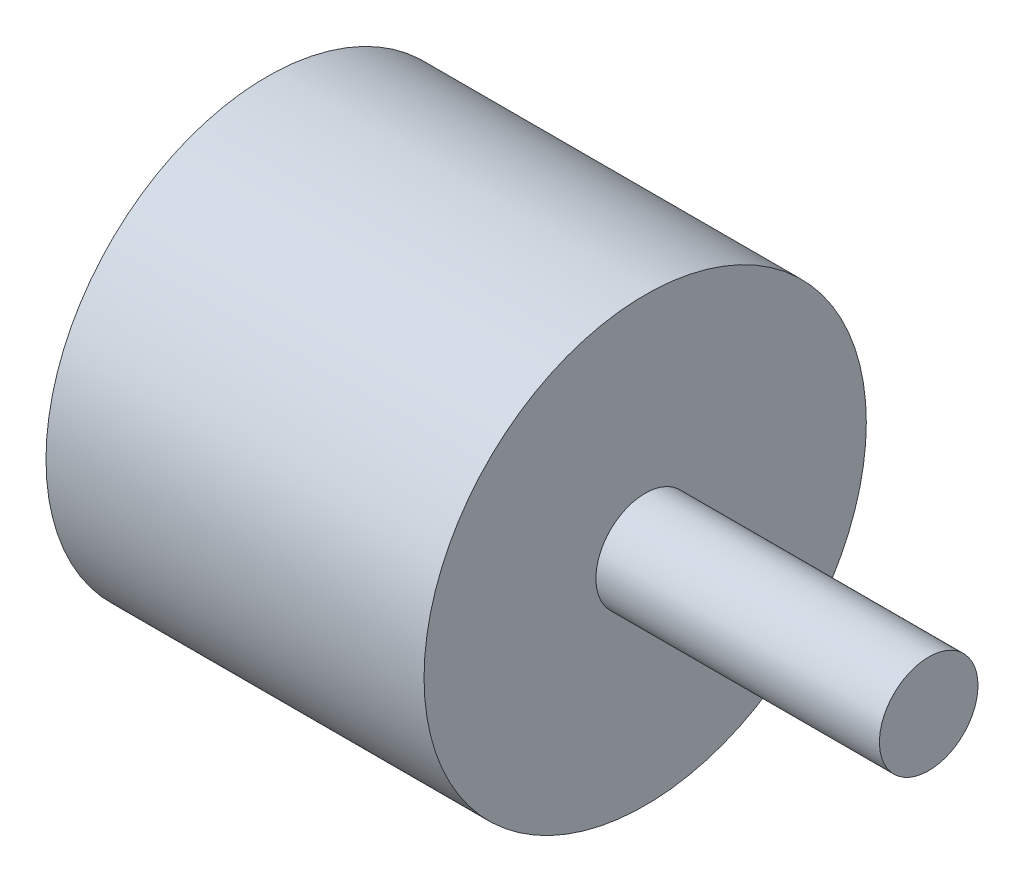
ISO-10303-21;
HEADER;
FILE_DESCRIPTION(('STEP AP214'),'2;1');
FILE_NAME('part.step','',(''),(''),'','','');
FILE_SCHEMA(('AUTOMOTIVE_DESIGN { 1 0 10303 214 1 1 1 1 }'));
ENDSEC;
DATA;
#1=APPLICATION_CONTEXT('core data for automotive mechanical design processes');
#2=APPLICATION_PROTOCOL_DEFINITION('international standard','automotive_design',2000,#1);
#3=PRODUCT_CONTEXT('',#1,'mechanical');
#4=PRODUCT('Part','Part','',(#3));
#5=PRODUCT_RELATED_PRODUCT_CATEGORY('part','',(#4));
#6=PRODUCT_DEFINITION_FORMATION('','',#4);
#7=PRODUCT_DEFINITION_CONTEXT('part definition',#1,'design');
#8=PRODUCT_DEFINITION('design','',#6,#7);
#9=PRODUCT_DEFINITION_SHAPE('','',#8);
#10=(LENGTH_UNIT() NAMED_UNIT(*) SI_UNIT(.MILLI.,.METRE.));
#11=(NAMED_UNIT(*) PLANE_ANGLE_UNIT() SI_UNIT($,.RADIAN.));
#12=(NAMED_UNIT(*) SI_UNIT($,.STERADIAN.) SOLID_ANGLE_UNIT());
#13=UNCERTAINTY_MEASURE_WITH_UNIT(LENGTH_MEASURE(1.E-05),#10,'distance_accuracy_value','');
#14=(GEOMETRIC_REPRESENTATION_CONTEXT(3) GLOBAL_UNCERTAINTY_ASSIGNED_CONTEXT((#13)) GLOBAL_UNIT_ASSIGNED_CONTEXT((#10,
#11,#12)) REPRESENTATION_CONTEXT('',''));
#15=CARTESIAN_POINT('',(0.,0.,0.));
#16=DIRECTION('',(0.,0.,1.));
#17=DIRECTION('',(1.,0.,0.));
#18=AXIS2_PLACEMENT_3D('',#15,#16,#17);
#19=CARTESIAN_POINT('',(40.,0.,0.));
#20=DIRECTION('',(-1.,0.,0.));
#21=DIRECTION('',(0.,0.,1.));
#22=AXIS2_PLACEMENT_3D('',#19,#20,#21);
#23=CYLINDRICAL_SURFACE('',#22,23.3971439157562);
#24=CARTESIAN_POINT('',(40.,0.,0.));
#25=DIRECTION('',(1.,0.,0.));
#26=DIRECTION('',(0.,0.,-1.));
#27=AXIS2_PLACEMENT_3D('',#24,#25,#26);
#28=CIRCLE('',#27,23.3971439157562);
#29=CARTESIAN_POINT('',(40.,0.,-23.3971439157562));
#30=VERTEX_POINT('',#29);
#31=EDGE_CURVE('E38',#30,#30,#28,.T.);
#32=ORIENTED_EDGE('',*,*,#31,.F.);
#33=EDGE_LOOP('',(#32));
#34=FACE_BOUND('',#33,.T.);
#35=CARTESIAN_POINT('',(0.,0.,0.));
#36=DIRECTION('',(1.,0.,0.));
#37=DIRECTION('',(0.,0.,-1.));
#38=AXIS2_PLACEMENT_3D('',#35,#36,#37);
#39=CIRCLE('',#38,23.3971439157562);
#40=CARTESIAN_POINT('',(0.,0.,-23.3971439157562));
#41=VERTEX_POINT('',#40);
#42=EDGE_CURVE('E34',#41,#41,#39,.T.);
#43=ORIENTED_EDGE('',*,*,#42,.T.);
#44=EDGE_LOOP('',(#43));
#45=FACE_BOUND('',#44,.T.);
#46=ADVANCED_FACE('F31',(#34,#45),#23,.T.);
#47=CARTESIAN_POINT('',(40.,0.,0.));
#48=DIRECTION('',(1.,0.,0.));
#49=DIRECTION('',(0.,0.,-1.));
#50=AXIS2_PLACEMENT_3D('',#47,#48,#49);
#51=PLANE('',#50);
#52=CARTESIAN_POINT('',(40.,0.,0.));
#53=DIRECTION('',(1.,0.,0.));
#54=DIRECTION('',(0.,0.,-1.));
#55=AXIS2_PLACEMENT_3D('',#52,#53,#54);
#56=CIRCLE('',#55,5.21429466032859);
#57=CARTESIAN_POINT('',(40.,0.,-5.21429466032859));
#58=VERTEX_POINT('',#57);
#59=EDGE_CURVE('E10',#58,#58,#56,.T.);
#60=ORIENTED_EDGE('',*,*,#59,.F.);
#61=EDGE_LOOP('',(#60));
#62=FACE_BOUND('',#61,.T.);
#63=ORIENTED_EDGE('',*,*,#31,.T.);
#64=EDGE_LOOP('',(#63));
#65=FACE_BOUND('',#64,.T.);
#66=ADVANCED_FACE('F55',(#62,#65),#51,.T.);
#67=CARTESIAN_POINT('',(0.,0.,0.));
#68=DIRECTION('',(1.,0.,0.));
#69=DIRECTION('',(0.,0.,-1.));
#70=AXIS2_PLACEMENT_3D('',#67,#68,#69);
#71=PLANE('',#70);
#72=ORIENTED_EDGE('',*,*,#42,.F.);
#73=EDGE_LOOP('',(#72));
#74=FACE_BOUND('',#73,.T.);
#75=ADVANCED_FACE('F52',(#74),#71,.F.);
#76=CARTESIAN_POINT('',(70.,0.,0.));
#77=DIRECTION('',(-1.,0.,0.));
#78=DIRECTION('',(0.,0.,1.));
#79=AXIS2_PLACEMENT_3D('',#76,#77,#78);
#80=CYLINDRICAL_SURFACE('',#79,5.21429466032859);
#81=CARTESIAN_POINT('',(70.,0.,0.));
#82=DIRECTION('',(1.,0.,0.));
#83=DIRECTION('',(0.,0.,-1.));
#84=AXIS2_PLACEMENT_3D('',#81,#82,#83);
#85=CIRCLE('',#84,5.21429466032859);
#86=CARTESIAN_POINT('',(70.,0.,-5.21429466032859));
#87=VERTEX_POINT('',#86);
#88=EDGE_CURVE('E44',#87,#87,#85,.T.);
#89=ORIENTED_EDGE('',*,*,#88,.F.);
#90=EDGE_LOOP('',(#89));
#91=FACE_BOUND('',#90,.T.);
#92=ORIENTED_EDGE('',*,*,#59,.T.);
#93=EDGE_LOOP('',(#92));
#94=FACE_BOUND('',#93,.T.);
#95=ADVANCED_FACE('F54',(#91,#94),#80,.T.);
#96=CARTESIAN_POINT('',(70.,0.,0.));
#97=DIRECTION('',(1.,0.,0.));
#98=DIRECTION('',(0.,0.,-1.));
#99=AXIS2_PLACEMENT_3D('',#96,#97,#98);
#100=PLANE('',#99);
#101=ORIENTED_EDGE('',*,*,#88,.T.);
#102=EDGE_LOOP('',(#101));
#103=FACE_BOUND('',#102,.T.);
#104=ADVANCED_FACE('F60',(#103),#100,.T.);
#105=CLOSED_SHELL('',(#46,#66,#75,#95,#104));
#106=MANIFOLD_SOLID_BREP('B2',#105);
#107=ADVANCED_BREP_SHAPE_REPRESENTATION('',(#18,#106),#14);
#108=SHAPE_DEFINITION_REPRESENTATION(#9,#107);
ENDSEC;
END-ISO-10303-21;
